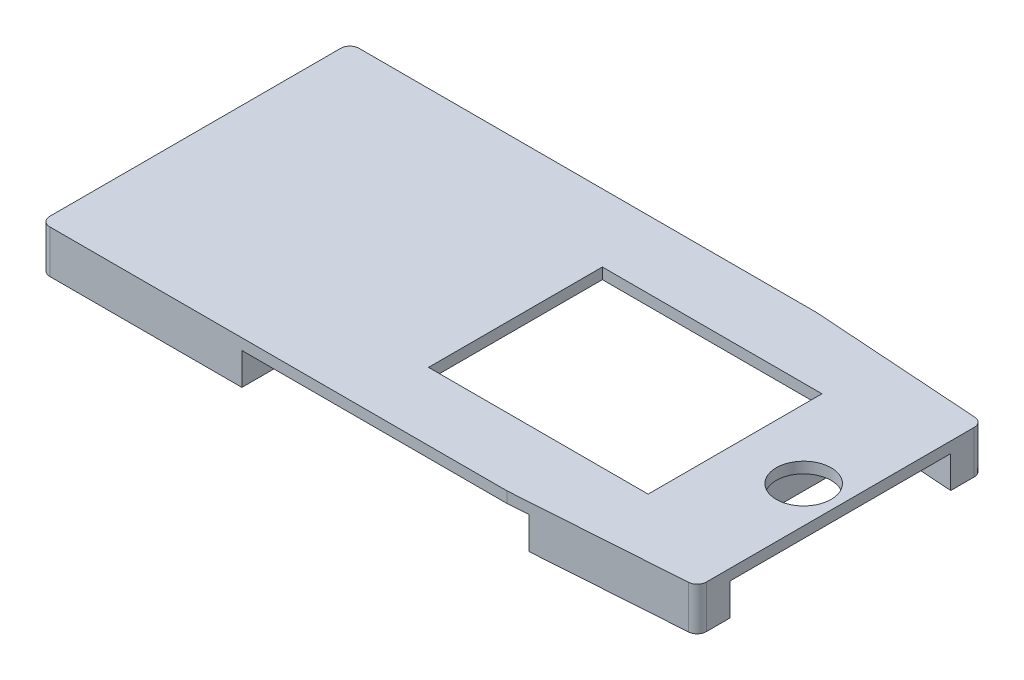
ISO-10303-21;
HEADER;
FILE_DESCRIPTION(('STEP AP214'),'2;1');
FILE_NAME('part.step','',(''),(''),'','','');
FILE_SCHEMA(('AUTOMOTIVE_DESIGN { 1 0 10303 214 1 1 1 1 }'));
ENDSEC;
DATA;
#1=APPLICATION_CONTEXT('core data for automotive mechanical design processes');
#2=APPLICATION_PROTOCOL_DEFINITION('international standard','automotive_design',2000,#1);
#3=PRODUCT_CONTEXT('',#1,'mechanical');
#4=PRODUCT('Part','Part','',(#3));
#5=PRODUCT_RELATED_PRODUCT_CATEGORY('part','',(#4));
#6=PRODUCT_DEFINITION_FORMATION('','',#4);
#7=PRODUCT_DEFINITION_CONTEXT('part definition',#1,'design');
#8=PRODUCT_DEFINITION('design','',#6,#7);
#9=PRODUCT_DEFINITION_SHAPE('','',#8);
#10=(LENGTH_UNIT() NAMED_UNIT(*) SI_UNIT(.MILLI.,.METRE.));
#11=(NAMED_UNIT(*) PLANE_ANGLE_UNIT() SI_UNIT($,.RADIAN.));
#12=(NAMED_UNIT(*) SI_UNIT($,.STERADIAN.) SOLID_ANGLE_UNIT());
#13=UNCERTAINTY_MEASURE_WITH_UNIT(LENGTH_MEASURE(1.E-05),#10,'distance_accuracy_value','');
#14=(GEOMETRIC_REPRESENTATION_CONTEXT(3) GLOBAL_UNCERTAINTY_ASSIGNED_CONTEXT((#13)) GLOBAL_UNIT_ASSIGNED_CONTEXT((#10,
#11,#12)) REPRESENTATION_CONTEXT('',''));
#15=CARTESIAN_POINT('',(0.,0.,0.));
#16=DIRECTION('',(0.,0.,1.));
#17=DIRECTION('',(1.,0.,0.));
#18=AXIS2_PLACEMENT_3D('',#15,#16,#17);
#19=CARTESIAN_POINT('',(0.,0.,0.));
#20=DIRECTION('',(0.,-1.,0.));
#21=DIRECTION('',(0.,0.,-1.));
#22=AXIS2_PLACEMENT_3D('',#19,#20,#21);
#23=PLANE('',#22);
#24=CARTESIAN_POINT('',(66.5,0.,-16.9));
#25=DIRECTION('',(0.,1.,0.));
#26=DIRECTION('',(0.,0.,1.));
#27=AXIS2_PLACEMENT_3D('',#24,#25,#26);
#28=CIRCLE('',#27,3.00000000000001);
#29=CARTESIAN_POINT('',(66.5,0.,-13.9));
#30=VERTEX_POINT('',#29);
#31=EDGE_CURVE('E436',#30,#30,#28,.T.);
#32=ORIENTED_EDGE('',*,*,#31,.T.);
#33=EDGE_LOOP('',(#32));
#34=FACE_BOUND('',#33,.T.);
#35=DIRECTION('',(0.0677923984636741,0.,-0.997699449088022));
#36=VECTOR('',#35,1.);
#37=CARTESIAN_POINT('',(53.2367275350985,0.,-33.6480172315895));
#38=LINE('',#37,#36);
#39=CARTESIAN_POINT('',(53.,0.,-30.1641025641026));
#40=VERTEX_POINT('',#39);
#41=CARTESIAN_POINT('',(53.2367275350985,0.,-33.6480172315895));
#42=VERTEX_POINT('',#41);
#43=EDGE_CURVE('E318',#40,#42,#38,.T.);
#44=ORIENTED_EDGE('',*,*,#43,.F.);
#45=DIRECTION('',(-0.997699449088022,0.,-0.0677923984636733));
#46=VECTOR('',#45,1.);
#47=CARTESIAN_POINT('',(53.,0.,-30.1641025641026));
#48=LINE('',#47,#46);
#49=CARTESIAN_POINT('',(70.5,0.,-28.975));
#50=VERTEX_POINT('',#49);
#51=EDGE_CURVE('E322',#50,#40,#48,.T.);
#52=ORIENTED_EDGE('',*,*,#51,.F.);
#53=DIRECTION('',(0.,0.,-1.));
#54=VECTOR('',#53,1.);
#55=CARTESIAN_POINT('',(70.5,0.,-32.475));
#56=LINE('',#55,#54);
#57=CARTESIAN_POINT('',(70.5,0.,-4.825));
#58=VERTEX_POINT('',#57);
#59=EDGE_CURVE('E499',#58,#50,#56,.T.);
#60=ORIENTED_EDGE('',*,*,#59,.F.);
#61=DIRECTION('',(0.997699449088022,0.,-0.067792398463673));
#62=VECTOR('',#61,1.);
#63=CARTESIAN_POINT('',(53.,0.,-3.63589743589744));
#64=LINE('',#63,#62);
#65=CARTESIAN_POINT('',(53.,0.,-3.63589743589744));
#66=VERTEX_POINT('',#65);
#67=EDGE_CURVE('E348',#66,#58,#64,.T.);
#68=ORIENTED_EDGE('',*,*,#67,.F.);
#69=DIRECTION('',(-0.067792398463674,0.,-0.997699449088022));
#70=VECTOR('',#69,1.);
#71=CARTESIAN_POINT('',(53.2367275350985,0.,-0.151982768410537));
#72=LINE('',#71,#70);
#73=CARTESIAN_POINT('',(53.2367275350985,0.,-0.151982768410537));
#74=VERTEX_POINT('',#73);
#75=EDGE_CURVE('E352',#74,#66,#72,.T.);
#76=ORIENTED_EDGE('',*,*,#75,.F.);
#77=DIRECTION('',(0.997699449088022,0.,-0.0677923984636733));
#78=VECTOR('',#77,1.);
#79=CARTESIAN_POINT('',(70.5,0.,-1.325));
#80=LINE('',#79,#78);
#81=CARTESIAN_POINT('',(51.,0.,0.));
#82=VERTEX_POINT('',#81);
#83=EDGE_CURVE('E495',#82,#74,#80,.T.);
#84=ORIENTED_EDGE('',*,*,#83,.F.);
#85=DIRECTION('',(1.,0.,0.));
#86=VECTOR('',#85,1.);
#87=CARTESIAN_POINT('',(0.,0.,0.));
#88=LINE('',#87,#86);
#89=CARTESIAN_POINT('',(22.,0.,0.));
#90=VERTEX_POINT('',#89);
#91=EDGE_CURVE('E468',#90,#82,#88,.T.);
#92=ORIENTED_EDGE('',*,*,#91,.F.);
#93=DIRECTION('',(0.,0.,1.));
#94=VECTOR('',#93,1.);
#95=CARTESIAN_POINT('',(22.,0.,0.));
#96=LINE('',#95,#94);
#97=CARTESIAN_POINT('',(22.,0.,-3.5));
#98=VERTEX_POINT('',#97);
#99=EDGE_CURVE('E372',#98,#90,#96,.T.);
#100=ORIENTED_EDGE('',*,*,#99,.F.);
#101=DIRECTION('',(1.,0.,0.));
#102=VECTOR('',#101,1.);
#103=CARTESIAN_POINT('',(3.5,0.,-3.5));
#104=LINE('',#103,#102);
#105=CARTESIAN_POINT('',(3.5,0.,-3.5));
#106=VERTEX_POINT('',#105);
#107=EDGE_CURVE('E406',#106,#98,#104,.T.);
#108=ORIENTED_EDGE('',*,*,#107,.F.);
#109=DIRECTION('',(0.,0.,1.));
#110=VECTOR('',#109,1.);
#111=CARTESIAN_POINT('',(3.5,0.,-30.3));
#112=LINE('',#111,#110);
#113=CARTESIAN_POINT('',(3.5,0.,-30.3));
#114=VERTEX_POINT('',#113);
#115=EDGE_CURVE('E402',#114,#106,#112,.T.);
#116=ORIENTED_EDGE('',*,*,#115,.F.);
#117=DIRECTION('',(-1.,0.,0.));
#118=VECTOR('',#117,1.);
#119=CARTESIAN_POINT('',(3.5,0.,-30.3));
#120=LINE('',#119,#118);
#121=CARTESIAN_POINT('',(22.,0.,-30.3));
#122=VERTEX_POINT('',#121);
#123=EDGE_CURVE('E398',#122,#114,#120,.T.);
#124=ORIENTED_EDGE('',*,*,#123,.F.);
#125=DIRECTION('',(0.,0.,1.));
#126=VECTOR('',#125,1.);
#127=CARTESIAN_POINT('',(22.,0.,-33.8));
#128=LINE('',#127,#126);
#129=CARTESIAN_POINT('',(22.,0.,-33.8));
#130=VERTEX_POINT('',#129);
#131=EDGE_CURVE('E356',#130,#122,#128,.T.);
#132=ORIENTED_EDGE('',*,*,#131,.F.);
#133=DIRECTION('',(-1.,0.,0.));
#134=VECTOR('',#133,1.);
#135=CARTESIAN_POINT('',(0.,0.,-33.8));
#136=LINE('',#135,#134);
#137=CARTESIAN_POINT('',(51.,0.,-33.8));
#138=VERTEX_POINT('',#137);
#139=EDGE_CURVE('E474',#138,#130,#136,.T.);
#140=ORIENTED_EDGE('',*,*,#139,.F.);
#141=DIRECTION('',(-0.997699449088022,0.,-0.0677923984636733));
#142=VECTOR('',#141,1.);
#143=CARTESIAN_POINT('',(51.,0.,-33.8));
#144=LINE('',#143,#142);
#145=EDGE_CURVE('E503',#42,#138,#144,.T.);
#146=ORIENTED_EDGE('',*,*,#145,.F.);
#147=EDGE_LOOP('',(#44,#52,#60,#68,#76,#84,#92,#100,#108,#116,#124,#132,#140,#146));
#148=FACE_BOUND('',#147,.T.);
#149=DIRECTION('',(0.,0.,1.));
#150=VECTOR('',#149,1.);
#151=CARTESIAN_POINT('',(62.5,0.,-7.4));
#152=LINE('',#151,#150);
#153=CARTESIAN_POINT('',(62.5,0.,-26.4));
#154=VERTEX_POINT('',#153);
#155=CARTESIAN_POINT('',(62.5,0.,-7.4));
#156=VERTEX_POINT('',#155);
#157=EDGE_CURVE('E267',#154,#156,#152,.T.);
#158=ORIENTED_EDGE('',*,*,#157,.F.);
#159=DIRECTION('',(1.,0.,0.));
#160=VECTOR('',#159,1.);
#161=CARTESIAN_POINT('',(59.,0.,-26.4));
#162=LINE('',#161,#160);
#163=CARTESIAN_POINT('',(59.,0.,-26.4));
#164=VERTEX_POINT('',#163);
#165=EDGE_CURVE('E265',#164,#154,#162,.T.);
#166=ORIENTED_EDGE('',*,*,#165,.F.);
#167=DIRECTION('',(-1.,0.,0.));
#168=VECTOR('',#167,1.);
#169=CARTESIAN_POINT('',(35.,0.,-26.4));
#170=LINE('',#169,#168);
#171=CARTESIAN_POINT('',(35.,0.,-26.4));
#172=VERTEX_POINT('',#171);
#173=EDGE_CURVE('E237',#164,#172,#170,.T.);
#174=ORIENTED_EDGE('',*,*,#173,.T.);
#175=DIRECTION('',(0.,0.,1.));
#176=VECTOR('',#175,1.);
#177=CARTESIAN_POINT('',(35.,0.,-26.4));
#178=LINE('',#177,#176);
#179=CARTESIAN_POINT('',(35.,0.,-7.4));
#180=VERTEX_POINT('',#179);
#181=EDGE_CURVE('E441',#172,#180,#178,.T.);
#182=ORIENTED_EDGE('',*,*,#181,.T.);
#183=DIRECTION('',(1.,0.,0.));
#184=VECTOR('',#183,1.);
#185=CARTESIAN_POINT('',(35.,0.,-7.4));
#186=LINE('',#185,#184);
#187=CARTESIAN_POINT('',(59.,0.,-7.4));
#188=VERTEX_POINT('',#187);
#189=EDGE_CURVE('E249',#180,#188,#186,.T.);
#190=ORIENTED_EDGE('',*,*,#189,.T.);
#191=DIRECTION('',(-1.,0.,0.));
#192=VECTOR('',#191,1.);
#193=CARTESIAN_POINT('',(59.,0.,-7.4));
#194=LINE('',#193,#192);
#195=EDGE_CURVE('E292',#156,#188,#194,.T.);
#196=ORIENTED_EDGE('',*,*,#195,.F.);
#197=EDGE_LOOP('',(#158,#166,#174,#182,#190,#196));
#198=FACE_BOUND('',#197,.T.);
#199=ADVANCED_FACE('F45',(#34,#148,#198),#23,.T.);
#200=CARTESIAN_POINT('',(0.,1.2,0.));
#201=DIRECTION('',(0.,-1.,0.));
#202=DIRECTION('',(0.,0.,-1.));
#203=AXIS2_PLACEMENT_3D('',#200,#201,#202);
#204=PLANE('',#203);
#205=DIRECTION('',(-1.,0.,0.));
#206=VECTOR('',#205,1.);
#207=CARTESIAN_POINT('',(0.,1.2,-33.8));
#208=LINE('',#207,#206);
#209=CARTESIAN_POINT('',(51.,1.2,-33.8));
#210=VERTEX_POINT('',#209);
#211=CARTESIAN_POINT('',(1.,1.2,-33.8));
#212=VERTEX_POINT('',#211);
#213=EDGE_CURVE('E488',#210,#212,#208,.T.);
#214=ORIENTED_EDGE('',*,*,#213,.T.);
#215=CARTESIAN_POINT('',(1.,1.2,-32.8));
#216=DIRECTION('',(0.,-1.,0.));
#217=DIRECTION('',(0.,0.,-1.));
#218=AXIS2_PLACEMENT_3D('',#215,#216,#217);
#219=CIRCLE('',#218,1.);
#220=CARTESIAN_POINT('',(0.,1.2,-32.8));
#221=VERTEX_POINT('',#220);
#222=EDGE_CURVE('E541',#212,#221,#219,.F.);
#223=ORIENTED_EDGE('',*,*,#222,.T.);
#224=DIRECTION('',(0.,0.,1.));
#225=VECTOR('',#224,1.);
#226=CARTESIAN_POINT('',(0.,1.2,0.));
#227=LINE('',#226,#225);
#228=CARTESIAN_POINT('',(0.,1.2,-1.));
#229=VERTEX_POINT('',#228);
#230=EDGE_CURVE('E469',#221,#229,#227,.T.);
#231=ORIENTED_EDGE('',*,*,#230,.T.);
#232=CARTESIAN_POINT('',(1.,1.2,-1.));
#233=DIRECTION('',(0.,-1.,0.));
#234=DIRECTION('',(0.,0.,-1.));
#235=AXIS2_PLACEMENT_3D('',#232,#233,#234);
#236=CIRCLE('',#235,1.);
#237=CARTESIAN_POINT('',(1.,1.2,0.));
#238=VERTEX_POINT('',#237);
#239=EDGE_CURVE('E532',#229,#238,#236,.F.);
#240=ORIENTED_EDGE('',*,*,#239,.T.);
#241=DIRECTION('',(1.,0.,0.));
#242=VECTOR('',#241,1.);
#243=CARTESIAN_POINT('',(0.,1.2,0.));
#244=LINE('',#243,#242);
#245=CARTESIAN_POINT('',(51.,1.2,0.));
#246=VERTEX_POINT('',#245);
#247=EDGE_CURVE('E473',#238,#246,#244,.T.);
#248=ORIENTED_EDGE('',*,*,#247,.T.);
#249=DIRECTION('',(0.997699449088022,0.,-0.0677923984636733));
#250=VECTOR('',#249,1.);
#251=CARTESIAN_POINT('',(70.5,1.2,-1.325));
#252=LINE('',#251,#250);
#253=CARTESIAN_POINT('',(69.5677923984637,1.2,-1.26165768861356));
#254=VERTEX_POINT('',#253);
#255=EDGE_CURVE('E477',#246,#254,#252,.T.);
#256=ORIENTED_EDGE('',*,*,#255,.T.);
#257=CARTESIAN_POINT('',(69.5,1.2,-2.25935713770158));
#258=DIRECTION('',(0.,-1.,0.));
#259=DIRECTION('',(0.,0.,-1.));
#260=AXIS2_PLACEMENT_3D('',#257,#258,#259);
#261=CIRCLE('',#260,1.);
#262=CARTESIAN_POINT('',(70.5,1.2,-2.25935713770158));
#263=VERTEX_POINT('',#262);
#264=EDGE_CURVE('E535',#254,#263,#261,.F.);
#265=ORIENTED_EDGE('',*,*,#264,.T.);
#266=DIRECTION('',(0.,0.,-1.));
#267=VECTOR('',#266,1.);
#268=CARTESIAN_POINT('',(70.5,1.2,-32.475));
#269=LINE('',#268,#267);
#270=CARTESIAN_POINT('',(70.5,1.2,-31.5406428622984));
#271=VERTEX_POINT('',#270);
#272=EDGE_CURVE('E481',#263,#271,#269,.T.);
#273=ORIENTED_EDGE('',*,*,#272,.T.);
#274=CARTESIAN_POINT('',(69.5,1.2,-31.5406428622984));
#275=DIRECTION('',(0.,-1.,0.));
#276=DIRECTION('',(0.,0.,-1.));
#277=AXIS2_PLACEMENT_3D('',#274,#275,#276);
#278=CIRCLE('',#277,1.);
#279=CARTESIAN_POINT('',(69.5677923984637,1.2,-32.5383423113864));
#280=VERTEX_POINT('',#279);
#281=EDGE_CURVE('E538',#271,#280,#278,.F.);
#282=ORIENTED_EDGE('',*,*,#281,.T.);
#283=DIRECTION('',(-0.997699449088022,0.,-0.0677923984636733));
#284=VECTOR('',#283,1.);
#285=CARTESIAN_POINT('',(51.,1.2,-33.8));
#286=LINE('',#285,#284);
#287=EDGE_CURVE('E485',#280,#210,#286,.T.);
#288=ORIENTED_EDGE('',*,*,#287,.T.);
#289=EDGE_LOOP('',(#214,#223,#231,#240,#248,#256,#265,#273,#282,#288));
#290=FACE_BOUND('',#289,.T.);
#291=DIRECTION('',(0.,0.,1.));
#292=VECTOR('',#291,1.);
#293=CARTESIAN_POINT('',(35.,1.2,-26.4));
#294=LINE('',#293,#292);
#295=CARTESIAN_POINT('',(35.,1.2,-26.4));
#296=VERTEX_POINT('',#295);
#297=CARTESIAN_POINT('',(35.,1.2,-7.4));
#298=VERTEX_POINT('',#297);
#299=EDGE_CURVE('E248',#296,#298,#294,.T.);
#300=ORIENTED_EDGE('',*,*,#299,.F.);
#301=DIRECTION('',(-1.,0.,0.));
#302=VECTOR('',#301,1.);
#303=CARTESIAN_POINT('',(35.,1.2,-26.4));
#304=LINE('',#303,#302);
#305=CARTESIAN_POINT('',(59.,1.2,-26.4));
#306=VERTEX_POINT('',#305);
#307=EDGE_CURVE('E452',#306,#296,#304,.T.);
#308=ORIENTED_EDGE('',*,*,#307,.F.);
#309=DIRECTION('',(0.,0.,-1.));
#310=VECTOR('',#309,1.);
#311=CARTESIAN_POINT('',(59.,1.2,-26.4));
#312=LINE('',#311,#310);
#313=CARTESIAN_POINT('',(59.,1.2,-7.4));
#314=VERTEX_POINT('',#313);
#315=EDGE_CURVE('E259',#314,#306,#312,.T.);
#316=ORIENTED_EDGE('',*,*,#315,.F.);
#317=DIRECTION('',(1.,0.,0.));
#318=VECTOR('',#317,1.);
#319=CARTESIAN_POINT('',(35.,1.2,-7.4));
#320=LINE('',#319,#318);
#321=EDGE_CURVE('E447',#298,#314,#320,.T.);
#322=ORIENTED_EDGE('',*,*,#321,.F.);
#323=EDGE_LOOP('',(#300,#308,#316,#322));
#324=FACE_BOUND('',#323,.T.);
#325=CARTESIAN_POINT('',(66.5,1.2,-16.9));
#326=DIRECTION('',(0.,1.,0.));
#327=DIRECTION('',(0.,0.,1.));
#328=AXIS2_PLACEMENT_3D('',#325,#326,#327);
#329=CIRCLE('',#328,3.00000000000001);
#330=CARTESIAN_POINT('',(66.5,1.2,-13.9));
#331=VERTEX_POINT('',#330);
#332=EDGE_CURVE('E437',#331,#331,#329,.T.);
#333=ORIENTED_EDGE('',*,*,#332,.F.);
#334=EDGE_LOOP('',(#333));
#335=FACE_BOUND('',#334,.T.);
#336=ADVANCED_FACE('F565',(#290,#324,#335),#204,.F.);
#337=CARTESIAN_POINT('',(0.,1.2,0.));
#338=DIRECTION('',(1.,0.,0.));
#339=DIRECTION('',(0.,0.,-1.));
#340=AXIS2_PLACEMENT_3D('',#337,#338,#339);
#341=PLANE('',#340);
#342=ORIENTED_EDGE('',*,*,#230,.F.);
#343=DIRECTION('',(0.,-1.,0.));
#344=VECTOR('',#343,1.);
#345=CARTESIAN_POINT('',(0.,1.2,-32.8));
#346=LINE('',#345,#344);
#347=CARTESIAN_POINT('',(0.,-3.5,-32.8));
#348=VERTEX_POINT('',#347);
#349=EDGE_CURVE('E519',#221,#348,#346,.T.);
#350=ORIENTED_EDGE('',*,*,#349,.T.);
#351=DIRECTION('',(0.,0.,-1.));
#352=VECTOR('',#351,1.);
#353=CARTESIAN_POINT('',(0.,-3.5,0.));
#354=LINE('',#353,#352);
#355=CARTESIAN_POINT('',(0.,-3.5,-1.));
#356=VERTEX_POINT('',#355);
#357=EDGE_CURVE('E367',#356,#348,#354,.T.);
#358=ORIENTED_EDGE('',*,*,#357,.F.);
#359=DIRECTION('',(0.,-1.,0.));
#360=VECTOR('',#359,1.);
#361=CARTESIAN_POINT('',(0.,1.2,-1.));
#362=LINE('',#361,#360);
#363=EDGE_CURVE('E516',#356,#229,#362,.F.);
#364=ORIENTED_EDGE('',*,*,#363,.T.);
#365=EDGE_LOOP('',(#342,#350,#358,#364));
#366=FACE_BOUND('',#365,.T.);
#367=ADVANCED_FACE('F623',(#366),#341,.F.);
#368=CARTESIAN_POINT('',(0.,1.2,0.));
#369=DIRECTION('',(0.,0.,-1.));
#370=DIRECTION('',(-1.,0.,0.));
#371=AXIS2_PLACEMENT_3D('',#368,#369,#370);
#372=PLANE('',#371);
#373=ORIENTED_EDGE('',*,*,#247,.F.);
#374=DIRECTION('',(0.,-1.,0.));
#375=VECTOR('',#374,1.);
#376=CARTESIAN_POINT('',(1.,1.2,0.));
#377=LINE('',#376,#375);
#378=CARTESIAN_POINT('',(1.,-3.5,0.));
#379=VERTEX_POINT('',#378);
#380=EDGE_CURVE('E11',#238,#379,#377,.T.);
#381=ORIENTED_EDGE('',*,*,#380,.T.);
#382=DIRECTION('',(-1.,0.,0.));
#383=VECTOR('',#382,1.);
#384=CARTESIAN_POINT('',(0.,-3.5,0.));
#385=LINE('',#384,#383);
#386=CARTESIAN_POINT('',(22.,-3.5,0.));
#387=VERTEX_POINT('',#386);
#388=EDGE_CURVE('E390',#387,#379,#385,.T.);
#389=ORIENTED_EDGE('',*,*,#388,.F.);
#390=DIRECTION('',(0.,1.,0.));
#391=VECTOR('',#390,1.);
#392=CARTESIAN_POINT('',(22.,-3.5,0.));
#393=LINE('',#392,#391);
#394=EDGE_CURVE('E394',#387,#90,#393,.T.);
#395=ORIENTED_EDGE('',*,*,#394,.T.);
#396=ORIENTED_EDGE('',*,*,#91,.T.);
#397=DIRECTION('',(0.,-1.,0.));
#398=VECTOR('',#397,1.);
#399=CARTESIAN_POINT('',(51.,1.2,0.));
#400=LINE('',#399,#398);
#401=EDGE_CURVE('E512',#246,#82,#400,.T.);
#402=ORIENTED_EDGE('',*,*,#401,.F.);
#403=EDGE_LOOP('',(#373,#381,#389,#395,#396,#402));
#404=FACE_BOUND('',#403,.T.);
#405=ADVANCED_FACE('F632',(#404),#372,.F.);
#406=CARTESIAN_POINT('',(70.5,1.2,-1.325));
#407=DIRECTION('',(-0.0677923984636733,0.,-0.997699449088022));
#408=DIRECTION('',(-0.997699449088022,0.,0.0677923984636733));
#409=AXIS2_PLACEMENT_3D('',#406,#407,#408);
#410=PLANE('',#409);
#411=DIRECTION('',(-0.997699449088022,0.,0.0677923984636733));
#412=VECTOR('',#411,1.);
#413=CARTESIAN_POINT('',(53.2367275350985,-3.5,-0.151982768410537));
#414=LINE('',#413,#412);
#415=CARTESIAN_POINT('',(69.5677923984637,-3.5,-1.26165768861356));
#416=VERTEX_POINT('',#415);
#417=CARTESIAN_POINT('',(53.2367275350985,-3.5,-0.151982768410537));
#418=VERTEX_POINT('',#417);
#419=EDGE_CURVE('E362',#416,#418,#414,.T.);
#420=ORIENTED_EDGE('',*,*,#419,.F.);
#421=DIRECTION('',(0.,-1.,0.));
#422=VECTOR('',#421,1.);
#423=CARTESIAN_POINT('',(69.5677923984637,1.2,-1.26165768861356));
#424=LINE('',#423,#422);
#425=EDGE_CURVE('E54',#416,#254,#424,.F.);
#426=ORIENTED_EDGE('',*,*,#425,.T.);
#427=ORIENTED_EDGE('',*,*,#255,.F.);
#428=ORIENTED_EDGE('',*,*,#401,.T.);
#429=ORIENTED_EDGE('',*,*,#83,.T.);
#430=DIRECTION('',(0.,1.,0.));
#431=VECTOR('',#430,1.);
#432=CARTESIAN_POINT('',(53.2367275350985,-3.5,-0.151982768410537));
#433=LINE('',#432,#431);
#434=EDGE_CURVE('E326',#418,#74,#433,.T.);
#435=ORIENTED_EDGE('',*,*,#434,.F.);
#436=EDGE_LOOP('',(#420,#426,#427,#428,#429,#435));
#437=FACE_BOUND('',#436,.T.);
#438=ADVANCED_FACE('F561',(#437),#410,.F.);
#439=CARTESIAN_POINT('',(70.5,1.2,-32.475));
#440=DIRECTION('',(-1.,0.,0.));
#441=DIRECTION('',(0.,0.,1.));
#442=AXIS2_PLACEMENT_3D('',#439,#440,#441);
#443=PLANE('',#442);
#444=DIRECTION('',(0.,0.,1.));
#445=VECTOR('',#444,1.);
#446=CARTESIAN_POINT('',(70.5,-3.5,-28.975));
#447=LINE('',#446,#445);
#448=CARTESIAN_POINT('',(70.5,-3.5,-31.5406428622984));
#449=VERTEX_POINT('',#448);
#450=CARTESIAN_POINT('',(70.5,-3.5,-28.975));
#451=VERTEX_POINT('',#450);
#452=EDGE_CURVE('E323',#449,#451,#447,.T.);
#453=ORIENTED_EDGE('',*,*,#452,.F.);
#454=DIRECTION('',(0.,-1.,0.));
#455=VECTOR('',#454,1.);
#456=CARTESIAN_POINT('',(70.5,1.2,-31.5406428622984));
#457=LINE('',#456,#455);
#458=EDGE_CURVE('E554',#449,#271,#457,.F.);
#459=ORIENTED_EDGE('',*,*,#458,.T.);
#460=ORIENTED_EDGE('',*,*,#272,.F.);
#461=DIRECTION('',(0.,-1.,0.));
#462=VECTOR('',#461,1.);
#463=CARTESIAN_POINT('',(70.5,1.2,-2.25935713770158));
#464=LINE('',#463,#462);
#465=CARTESIAN_POINT('',(70.5,-3.5,-2.25935713770158));
#466=VERTEX_POINT('',#465);
#467=EDGE_CURVE('E551',#263,#466,#464,.T.);
#468=ORIENTED_EDGE('',*,*,#467,.T.);
#469=DIRECTION('',(0.,0.,1.));
#470=VECTOR('',#469,1.);
#471=CARTESIAN_POINT('',(70.5,-3.5,-4.825));
#472=LINE('',#471,#470);
#473=CARTESIAN_POINT('',(70.5,-3.5,-4.825));
#474=VERTEX_POINT('',#473);
#475=EDGE_CURVE('E353',#474,#466,#472,.T.);
#476=ORIENTED_EDGE('',*,*,#475,.F.);
#477=DIRECTION('',(0.,1.,0.));
#478=VECTOR('',#477,1.);
#479=CARTESIAN_POINT('',(70.5,-3.5,-4.825));
#480=LINE('',#479,#478);
#481=EDGE_CURVE('E344',#474,#58,#480,.T.);
#482=ORIENTED_EDGE('',*,*,#481,.T.);
#483=ORIENTED_EDGE('',*,*,#59,.T.);
#484=DIRECTION('',(0.,1.,0.));
#485=VECTOR('',#484,1.);
#486=CARTESIAN_POINT('',(70.5,-3.5,-28.975));
#487=LINE('',#486,#485);
#488=EDGE_CURVE('E272',#451,#50,#487,.T.);
#489=ORIENTED_EDGE('',*,*,#488,.F.);
#490=EDGE_LOOP('',(#453,#459,#460,#468,#476,#482,#483,#489));
#491=FACE_BOUND('',#490,.T.);
#492=ADVANCED_FACE('F574',(#491),#443,.F.);
#493=CARTESIAN_POINT('',(51.,1.2,-33.8));
#494=DIRECTION('',(-0.0677923984636733,0.,0.997699449088022));
#495=DIRECTION('',(0.997699449088022,0.,0.0677923984636733));
#496=AXIS2_PLACEMENT_3D('',#493,#494,#495);
#497=PLANE('',#496);
#498=ORIENTED_EDGE('',*,*,#287,.F.);
#499=DIRECTION('',(0.,-1.,0.));
#500=VECTOR('',#499,1.);
#501=CARTESIAN_POINT('',(69.5677923984637,1.2,-32.5383423113864));
#502=LINE('',#501,#500);
#503=CARTESIAN_POINT('',(69.5677923984637,-3.5,-32.5383423113864));
#504=VERTEX_POINT('',#503);
#505=EDGE_CURVE('E544',#280,#504,#502,.T.);
#506=ORIENTED_EDGE('',*,*,#505,.T.);
#507=DIRECTION('',(0.997699449088022,0.,0.0677923984636732));
#508=VECTOR('',#507,1.);
#509=CARTESIAN_POINT('',(70.5,-3.5,-32.475));
#510=LINE('',#509,#508);
#511=CARTESIAN_POINT('',(53.2367275350985,-3.5,-33.6480172315895));
#512=VERTEX_POINT('',#511);
#513=EDGE_CURVE('E317',#512,#504,#510,.T.);
#514=ORIENTED_EDGE('',*,*,#513,.F.);
#515=DIRECTION('',(0.,1.,0.));
#516=VECTOR('',#515,1.);
#517=CARTESIAN_POINT('',(53.2367275350985,-3.5,-33.6480172315895));
#518=LINE('',#517,#516);
#519=EDGE_CURVE('E314',#512,#42,#518,.T.);
#520=ORIENTED_EDGE('',*,*,#519,.T.);
#521=ORIENTED_EDGE('',*,*,#145,.T.);
#522=DIRECTION('',(0.,-1.,0.));
#523=VECTOR('',#522,1.);
#524=CARTESIAN_POINT('',(51.,1.2,-33.8));
#525=LINE('',#524,#523);
#526=EDGE_CURVE('E492',#210,#138,#525,.T.);
#527=ORIENTED_EDGE('',*,*,#526,.F.);
#528=EDGE_LOOP('',(#498,#506,#514,#520,#521,#527));
#529=FACE_BOUND('',#528,.T.);
#530=ADVANCED_FACE('F609',(#529),#497,.F.);
#531=CARTESIAN_POINT('',(0.,1.2,-33.8));
#532=DIRECTION('',(0.,0.,1.));
#533=DIRECTION('',(1.,0.,0.));
#534=AXIS2_PLACEMENT_3D('',#531,#532,#533);
#535=PLANE('',#534);
#536=DIRECTION('',(1.,0.,0.));
#537=VECTOR('',#536,1.);
#538=CARTESIAN_POINT('',(0.,-3.5,-33.8));
#539=LINE('',#538,#537);
#540=CARTESIAN_POINT('',(1.,-3.5,-33.8));
#541=VERTEX_POINT('',#540);
#542=CARTESIAN_POINT('',(22.,-3.5,-33.8));
#543=VERTEX_POINT('',#542);
#544=EDGE_CURVE('E371',#541,#543,#539,.T.);
#545=ORIENTED_EDGE('',*,*,#544,.F.);
#546=DIRECTION('',(0.,-1.,0.));
#547=VECTOR('',#546,1.);
#548=CARTESIAN_POINT('',(1.,1.2,-33.8));
#549=LINE('',#548,#547);
#550=EDGE_CURVE('E529',#541,#212,#549,.F.);
#551=ORIENTED_EDGE('',*,*,#550,.T.);
#552=ORIENTED_EDGE('',*,*,#213,.F.);
#553=ORIENTED_EDGE('',*,*,#526,.T.);
#554=ORIENTED_EDGE('',*,*,#139,.T.);
#555=DIRECTION('',(0.,1.,0.));
#556=VECTOR('',#555,1.);
#557=CARTESIAN_POINT('',(22.,-3.5,-33.8));
#558=LINE('',#557,#556);
#559=EDGE_CURVE('E432',#543,#130,#558,.T.);
#560=ORIENTED_EDGE('',*,*,#559,.F.);
#561=EDGE_LOOP('',(#545,#551,#552,#553,#554,#560));
#562=FACE_BOUND('',#561,.T.);
#563=ADVANCED_FACE('F614',(#562),#535,.F.);
#564=CARTESIAN_POINT('',(35.,1.2,-26.4));
#565=DIRECTION('',(1.,0.,0.));
#566=DIRECTION('',(0.,0.,-1.));
#567=AXIS2_PLACEMENT_3D('',#564,#565,#566);
#568=PLANE('',#567);
#569=ORIENTED_EDGE('',*,*,#181,.F.);
#570=DIRECTION('',(0.,-1.,0.));
#571=VECTOR('',#570,1.);
#572=CARTESIAN_POINT('',(35.,1.2,-26.4));
#573=LINE('',#572,#571);
#574=EDGE_CURVE('E243',#296,#172,#573,.T.);
#575=ORIENTED_EDGE('',*,*,#574,.F.);
#576=ORIENTED_EDGE('',*,*,#299,.T.);
#577=DIRECTION('',(0.,-1.,0.));
#578=VECTOR('',#577,1.);
#579=CARTESIAN_POINT('',(35.,1.2,-7.4));
#580=LINE('',#579,#578);
#581=EDGE_CURVE('E464',#298,#180,#580,.T.);
#582=ORIENTED_EDGE('',*,*,#581,.T.);
#583=EDGE_LOOP('',(#569,#575,#576,#582));
#584=FACE_BOUND('',#583,.T.);
#585=ADVANCED_FACE('F657',(#584),#568,.T.);
#586=CARTESIAN_POINT('',(35.,1.2,-7.4));
#587=DIRECTION('',(0.,0.,-1.));
#588=DIRECTION('',(-1.,0.,0.));
#589=AXIS2_PLACEMENT_3D('',#586,#587,#588);
#590=PLANE('',#589);
#591=ORIENTED_EDGE('',*,*,#189,.F.);
#592=ORIENTED_EDGE('',*,*,#581,.F.);
#593=ORIENTED_EDGE('',*,*,#321,.T.);
#594=DIRECTION('',(0.,-1.,0.));
#595=VECTOR('',#594,1.);
#596=CARTESIAN_POINT('',(59.,1.2,-7.4));
#597=LINE('',#596,#595);
#598=EDGE_CURVE('E262',#314,#188,#597,.T.);
#599=ORIENTED_EDGE('',*,*,#598,.T.);
#600=EDGE_LOOP('',(#591,#592,#593,#599));
#601=FACE_BOUND('',#600,.T.);
#602=ADVANCED_FACE('F858',(#601),#590,.T.);
#603=CARTESIAN_POINT('',(59.,1.2,-26.4));
#604=DIRECTION('',(-1.,0.,0.));
#605=DIRECTION('',(0.,0.,1.));
#606=AXIS2_PLACEMENT_3D('',#603,#604,#605);
#607=PLANE('',#606);
#608=DIRECTION('',(0.,-1.,0.));
#609=VECTOR('',#608,1.);
#610=CARTESIAN_POINT('',(59.,1.2,-26.4));
#611=LINE('',#610,#609);
#612=EDGE_CURVE('E240',#306,#164,#611,.T.);
#613=ORIENTED_EDGE('',*,*,#612,.T.);
#614=DIRECTION('',(0.,1.,0.));
#615=VECTOR('',#614,1.);
#616=CARTESIAN_POINT('',(59.,-3.5,-26.4));
#617=LINE('',#616,#615);
#618=CARTESIAN_POINT('',(59.,-3.5,-26.4));
#619=VERTEX_POINT('',#618);
#620=EDGE_CURVE('E256',#619,#164,#617,.T.);
#621=ORIENTED_EDGE('',*,*,#620,.F.);
#622=DIRECTION('',(0.,0.,-1.));
#623=VECTOR('',#622,1.);
#624=CARTESIAN_POINT('',(59.,-3.5,-7.4));
#625=LINE('',#624,#623);
#626=CARTESIAN_POINT('',(59.,-3.5,-7.4));
#627=VERTEX_POINT('',#626);
#628=EDGE_CURVE('E296',#627,#619,#625,.T.);
#629=ORIENTED_EDGE('',*,*,#628,.F.);
#630=DIRECTION('',(0.,1.,0.));
#631=VECTOR('',#630,1.);
#632=CARTESIAN_POINT('',(59.,-3.5,-7.4));
#633=LINE('',#632,#631);
#634=EDGE_CURVE('E287',#627,#188,#633,.T.);
#635=ORIENTED_EDGE('',*,*,#634,.T.);
#636=ORIENTED_EDGE('',*,*,#598,.F.);
#637=ORIENTED_EDGE('',*,*,#315,.T.);
#638=EDGE_LOOP('',(#613,#621,#629,#635,#636,#637));
#639=FACE_BOUND('',#638,.T.);
#640=ADVANCED_FACE('F253',(#639),#607,.T.);
#641=CARTESIAN_POINT('',(35.,1.2,-26.4));
#642=DIRECTION('',(0.,0.,1.));
#643=DIRECTION('',(1.,0.,0.));
#644=AXIS2_PLACEMENT_3D('',#641,#642,#643);
#645=PLANE('',#644);
#646=ORIENTED_EDGE('',*,*,#173,.F.);
#647=ORIENTED_EDGE('',*,*,#612,.F.);
#648=ORIENTED_EDGE('',*,*,#307,.T.);
#649=ORIENTED_EDGE('',*,*,#574,.T.);
#650=EDGE_LOOP('',(#646,#647,#648,#649));
#651=FACE_BOUND('',#650,.T.);
#652=ADVANCED_FACE('F239',(#651),#645,.T.);
#653=CARTESIAN_POINT('',(66.5,1.2,-16.9));
#654=DIRECTION('',(0.,-1.,0.));
#655=DIRECTION('',(0.,0.,-1.));
#656=AXIS2_PLACEMENT_3D('',#653,#654,#655);
#657=CYLINDRICAL_SURFACE('',#656,3.00000000000001);
#658=ORIENTED_EDGE('',*,*,#332,.T.);
#659=EDGE_LOOP('',(#658));
#660=FACE_BOUND('',#659,.T.);
#661=ORIENTED_EDGE('',*,*,#31,.F.);
#662=EDGE_LOOP('',(#661));
#663=FACE_BOUND('',#662,.T.);
#664=ADVANCED_FACE('F829',(#660,#663),#657,.F.);
#665=CARTESIAN_POINT('',(22.,-3.5,-33.8));
#666=DIRECTION('',(-1.,0.,0.));
#667=DIRECTION('',(0.,0.,1.));
#668=AXIS2_PLACEMENT_3D('',#665,#666,#667);
#669=PLANE('',#668);
#670=ORIENTED_EDGE('',*,*,#131,.T.);
#671=DIRECTION('',(0.,1.,0.));
#672=VECTOR('',#671,1.);
#673=CARTESIAN_POINT('',(22.,-3.5,-30.3));
#674=LINE('',#673,#672);
#675=CARTESIAN_POINT('',(22.,-3.5,-30.3));
#676=VERTEX_POINT('',#675);
#677=EDGE_CURVE('E428',#676,#122,#674,.T.);
#678=ORIENTED_EDGE('',*,*,#677,.F.);
#679=DIRECTION('',(0.,0.,1.));
#680=VECTOR('',#679,1.);
#681=CARTESIAN_POINT('',(22.,-3.5,-33.8));
#682=LINE('',#681,#680);
#683=EDGE_CURVE('E375',#543,#676,#682,.T.);
#684=ORIENTED_EDGE('',*,*,#683,.F.);
#685=ORIENTED_EDGE('',*,*,#559,.T.);
#686=EDGE_LOOP('',(#670,#678,#684,#685));
#687=FACE_BOUND('',#686,.T.);
#688=ADVANCED_FACE('F819',(#687),#669,.F.);
#689=CARTESIAN_POINT('',(3.5,-3.5,-30.3));
#690=DIRECTION('',(0.,0.,-1.));
#691=DIRECTION('',(-1.,0.,0.));
#692=AXIS2_PLACEMENT_3D('',#689,#690,#691);
#693=PLANE('',#692);
#694=ORIENTED_EDGE('',*,*,#123,.T.);
#695=DIRECTION('',(0.,1.,0.));
#696=VECTOR('',#695,1.);
#697=CARTESIAN_POINT('',(3.5,-3.5,-30.3));
#698=LINE('',#697,#696);
#699=CARTESIAN_POINT('',(3.5,-3.5,-30.3));
#700=VERTEX_POINT('',#699);
#701=EDGE_CURVE('E424',#700,#114,#698,.T.);
#702=ORIENTED_EDGE('',*,*,#701,.F.);
#703=DIRECTION('',(-1.,0.,0.));
#704=VECTOR('',#703,1.);
#705=CARTESIAN_POINT('',(3.5,-3.5,-30.3));
#706=LINE('',#705,#704);
#707=EDGE_CURVE('E378',#676,#700,#706,.T.);
#708=ORIENTED_EDGE('',*,*,#707,.F.);
#709=ORIENTED_EDGE('',*,*,#677,.T.);
#710=EDGE_LOOP('',(#694,#702,#708,#709));
#711=FACE_BOUND('',#710,.T.);
#712=ADVANCED_FACE('F809',(#711),#693,.F.);
#713=CARTESIAN_POINT('',(3.5,-3.5,-30.3));
#714=DIRECTION('',(-1.,0.,0.));
#715=DIRECTION('',(0.,0.,1.));
#716=AXIS2_PLACEMENT_3D('',#713,#714,#715);
#717=PLANE('',#716);
#718=ORIENTED_EDGE('',*,*,#115,.T.);
#719=DIRECTION('',(0.,1.,0.));
#720=VECTOR('',#719,1.);
#721=CARTESIAN_POINT('',(3.5,-3.5,-3.5));
#722=LINE('',#721,#720);
#723=CARTESIAN_POINT('',(3.5,-3.5,-3.5));
#724=VERTEX_POINT('',#723);
#725=EDGE_CURVE('E420',#724,#106,#722,.T.);
#726=ORIENTED_EDGE('',*,*,#725,.F.);
#727=DIRECTION('',(0.,0.,1.));
#728=VECTOR('',#727,1.);
#729=CARTESIAN_POINT('',(3.5,-3.5,-30.3));
#730=LINE('',#729,#728);
#731=EDGE_CURVE('E381',#700,#724,#730,.T.);
#732=ORIENTED_EDGE('',*,*,#731,.F.);
#733=ORIENTED_EDGE('',*,*,#701,.T.);
#734=EDGE_LOOP('',(#718,#726,#732,#733));
#735=FACE_BOUND('',#734,.T.);
#736=ADVANCED_FACE('F799',(#735),#717,.F.);
#737=CARTESIAN_POINT('',(3.5,-3.5,-3.5));
#738=DIRECTION('',(0.,0.,1.));
#739=DIRECTION('',(1.,0.,0.));
#740=AXIS2_PLACEMENT_3D('',#737,#738,#739);
#741=PLANE('',#740);
#742=ORIENTED_EDGE('',*,*,#107,.T.);
#743=DIRECTION('',(0.,1.,0.));
#744=VECTOR('',#743,1.);
#745=CARTESIAN_POINT('',(22.,-3.5,-3.5));
#746=LINE('',#745,#744);
#747=CARTESIAN_POINT('',(22.,-3.5,-3.5));
#748=VERTEX_POINT('',#747);
#749=EDGE_CURVE('E416',#748,#98,#746,.T.);
#750=ORIENTED_EDGE('',*,*,#749,.F.);
#751=DIRECTION('',(1.,0.,0.));
#752=VECTOR('',#751,1.);
#753=CARTESIAN_POINT('',(3.5,-3.5,-3.5));
#754=LINE('',#753,#752);
#755=EDGE_CURVE('E384',#724,#748,#754,.T.);
#756=ORIENTED_EDGE('',*,*,#755,.F.);
#757=ORIENTED_EDGE('',*,*,#725,.T.);
#758=EDGE_LOOP('',(#742,#750,#756,#757));
#759=FACE_BOUND('',#758,.T.);
#760=ADVANCED_FACE('F789',(#759),#741,.F.);
#761=CARTESIAN_POINT('',(22.,-3.5,0.));
#762=DIRECTION('',(-1.,0.,0.));
#763=DIRECTION('',(0.,0.,1.));
#764=AXIS2_PLACEMENT_3D('',#761,#762,#763);
#765=PLANE('',#764);
#766=ORIENTED_EDGE('',*,*,#99,.T.);
#767=ORIENTED_EDGE('',*,*,#394,.F.);
#768=DIRECTION('',(0.,0.,1.));
#769=VECTOR('',#768,1.);
#770=CARTESIAN_POINT('',(22.,-3.5,0.));
#771=LINE('',#770,#769);
#772=EDGE_CURVE('E387',#748,#387,#771,.T.);
#773=ORIENTED_EDGE('',*,*,#772,.F.);
#774=ORIENTED_EDGE('',*,*,#749,.T.);
#775=EDGE_LOOP('',(#766,#767,#773,#774));
#776=FACE_BOUND('',#775,.T.);
#777=ADVANCED_FACE('F643',(#776),#765,.F.);
#778=CARTESIAN_POINT('',(0.,-3.5,0.));
#779=DIRECTION('',(0.,-1.,0.));
#780=DIRECTION('',(0.,0.,-1.));
#781=AXIS2_PLACEMENT_3D('',#778,#779,#780);
#782=PLANE('',#781);
#783=ORIENTED_EDGE('',*,*,#357,.T.);
#784=CARTESIAN_POINT('',(1.,-3.5,-32.8));
#785=DIRECTION('',(0.,-1.,0.));
#786=DIRECTION('',(0.,0.,-1.));
#787=AXIS2_PLACEMENT_3D('',#784,#785,#786);
#788=CIRCLE('',#787,1.);
#789=EDGE_CURVE('E526',#348,#541,#788,.T.);
#790=ORIENTED_EDGE('',*,*,#789,.T.);
#791=ORIENTED_EDGE('',*,*,#544,.T.);
#792=ORIENTED_EDGE('',*,*,#683,.T.);
#793=ORIENTED_EDGE('',*,*,#707,.T.);
#794=ORIENTED_EDGE('',*,*,#731,.T.);
#795=ORIENTED_EDGE('',*,*,#755,.T.);
#796=ORIENTED_EDGE('',*,*,#772,.T.);
#797=ORIENTED_EDGE('',*,*,#388,.T.);
#798=CARTESIAN_POINT('',(1.,-3.5,-1.));
#799=DIRECTION('',(0.,-1.,0.));
#800=DIRECTION('',(0.,0.,-1.));
#801=AXIS2_PLACEMENT_3D('',#798,#799,#800);
#802=CIRCLE('',#801,1.);
#803=EDGE_CURVE('E523',#379,#356,#802,.T.);
#804=ORIENTED_EDGE('',*,*,#803,.T.);
#805=EDGE_LOOP('',(#783,#790,#791,#792,#793,#794,#795,#796,#797,#804));
#806=FACE_BOUND('',#805,.T.);
#807=ADVANCED_FACE('F626',(#806),#782,.T.);
#808=CARTESIAN_POINT('',(53.2367275350985,-3.5,-0.151982768410537));
#809=DIRECTION('',(0.997699449088022,0.,-0.067792398463674));
#810=DIRECTION('',(-0.067792398463674,0.,-0.997699449088022));
#811=AXIS2_PLACEMENT_3D('',#808,#809,#810);
#812=PLANE('',#811);
#813=ORIENTED_EDGE('',*,*,#75,.T.);
#814=DIRECTION('',(0.,1.,0.));
#815=VECTOR('',#814,1.);
#816=CARTESIAN_POINT('',(53.,-3.5,-3.63589743589744));
#817=LINE('',#816,#815);
#818=CARTESIAN_POINT('',(53.,-3.5,-3.63589743589744));
#819=VERTEX_POINT('',#818);
#820=EDGE_CURVE('E340',#819,#66,#817,.T.);
#821=ORIENTED_EDGE('',*,*,#820,.F.);
#822=DIRECTION('',(-0.067792398463674,0.,-0.997699449088022));
#823=VECTOR('',#822,1.);
#824=CARTESIAN_POINT('',(53.2367275350985,-3.5,-0.151982768410537));
#825=LINE('',#824,#823);
#826=EDGE_CURVE('E359',#418,#819,#825,.T.);
#827=ORIENTED_EDGE('',*,*,#826,.F.);
#828=ORIENTED_EDGE('',*,*,#434,.T.);
#829=EDGE_LOOP('',(#813,#821,#827,#828));
#830=FACE_BOUND('',#829,.T.);
#831=ADVANCED_FACE('F635',(#830),#812,.F.);
#832=CARTESIAN_POINT('',(53.,-3.5,-3.63589743589744));
#833=DIRECTION('',(0.067792398463673,0.,0.997699449088022));
#834=DIRECTION('',(0.997699449088022,0.,-0.067792398463673));
#835=AXIS2_PLACEMENT_3D('',#832,#833,#834);
#836=PLANE('',#835);
#837=ORIENTED_EDGE('',*,*,#67,.T.);
#838=ORIENTED_EDGE('',*,*,#481,.F.);
#839=DIRECTION('',(0.997699449088022,0.,-0.067792398463673));
#840=VECTOR('',#839,1.);
#841=CARTESIAN_POINT('',(53.,-3.5,-3.63589743589744));
#842=LINE('',#841,#840);
#843=EDGE_CURVE('E347',#819,#474,#842,.T.);
#844=ORIENTED_EDGE('',*,*,#843,.F.);
#845=ORIENTED_EDGE('',*,*,#820,.T.);
#846=EDGE_LOOP('',(#837,#838,#844,#845));
#847=FACE_BOUND('',#846,.T.);
#848=ADVANCED_FACE('F581',(#847),#836,.F.);
#849=CARTESIAN_POINT('',(0.,-3.5,0.));
#850=DIRECTION('',(0.,1.,0.));
#851=DIRECTION('',(0.,0.,1.));
#852=AXIS2_PLACEMENT_3D('',#849,#850,#851);
#853=PLANE('',#852);
#854=ORIENTED_EDGE('',*,*,#475,.T.);
#855=CARTESIAN_POINT('',(69.5,-3.5,-2.25935713770158));
#856=DIRECTION('',(0.,1.,0.));
#857=DIRECTION('',(0.,0.,1.));
#858=AXIS2_PLACEMENT_3D('',#855,#856,#857);
#859=CIRCLE('',#858,1.);
#860=EDGE_CURVE('E61',#466,#416,#859,.F.);
#861=ORIENTED_EDGE('',*,*,#860,.T.);
#862=ORIENTED_EDGE('',*,*,#419,.T.);
#863=ORIENTED_EDGE('',*,*,#826,.T.);
#864=ORIENTED_EDGE('',*,*,#843,.T.);
#865=EDGE_LOOP('',(#854,#861,#862,#863,#864));
#866=FACE_BOUND('',#865,.T.);
#867=ADVANCED_FACE('F575',(#866),#853,.F.);
#868=CARTESIAN_POINT('',(53.,-3.5,-30.1641025641026));
#869=DIRECTION('',(0.0677923984636733,0.,-0.997699449088022));
#870=DIRECTION('',(-0.997699449088022,0.,-0.0677923984636733));
#871=AXIS2_PLACEMENT_3D('',#868,#869,#870);
#872=PLANE('',#871);
#873=ORIENTED_EDGE('',*,*,#51,.T.);
#874=DIRECTION('',(0.,1.,0.));
#875=VECTOR('',#874,1.);
#876=CARTESIAN_POINT('',(53.,-3.5,-30.1641025641026));
#877=LINE('',#876,#875);
#878=CARTESIAN_POINT('',(53.,-3.5,-30.1641025641026));
#879=VERTEX_POINT('',#878);
#880=EDGE_CURVE('E310',#879,#40,#877,.T.);
#881=ORIENTED_EDGE('',*,*,#880,.F.);
#882=DIRECTION('',(-0.997699449088022,0.,-0.0677923984636733));
#883=VECTOR('',#882,1.);
#884=CARTESIAN_POINT('',(53.,-3.5,-30.1641025641026));
#885=LINE('',#884,#883);
#886=EDGE_CURVE('E333',#451,#879,#885,.T.);
#887=ORIENTED_EDGE('',*,*,#886,.F.);
#888=ORIENTED_EDGE('',*,*,#488,.T.);
#889=EDGE_LOOP('',(#873,#881,#887,#888));
#890=FACE_BOUND('',#889,.T.);
#891=ADVANCED_FACE('F592',(#890),#872,.F.);
#892=CARTESIAN_POINT('',(53.2367275350985,-3.5,-33.6480172315895));
#893=DIRECTION('',(0.997699449088022,0.,0.0677923984636741));
#894=DIRECTION('',(0.0677923984636741,0.,-0.997699449088022));
#895=AXIS2_PLACEMENT_3D('',#892,#893,#894);
#896=PLANE('',#895);
#897=ORIENTED_EDGE('',*,*,#43,.T.);
#898=ORIENTED_EDGE('',*,*,#519,.F.);
#899=DIRECTION('',(0.0677923984636741,0.,-0.997699449088022));
#900=VECTOR('',#899,1.);
#901=CARTESIAN_POINT('',(53.2367275350985,-3.5,-33.6480172315895));
#902=LINE('',#901,#900);
#903=EDGE_CURVE('E330',#879,#512,#902,.T.);
#904=ORIENTED_EDGE('',*,*,#903,.F.);
#905=ORIENTED_EDGE('',*,*,#880,.T.);
#906=EDGE_LOOP('',(#897,#898,#904,#905));
#907=FACE_BOUND('',#906,.T.);
#908=ADVANCED_FACE('F596',(#907),#896,.F.);
#909=CARTESIAN_POINT('',(0.,-3.5,0.));
#910=DIRECTION('',(0.,1.,0.));
#911=DIRECTION('',(0.,0.,1.));
#912=AXIS2_PLACEMENT_3D('',#909,#910,#911);
#913=PLANE('',#912);
#914=ORIENTED_EDGE('',*,*,#513,.T.);
#915=CARTESIAN_POINT('',(69.5,-3.5,-31.5406428622984));
#916=DIRECTION('',(0.,1.,0.));
#917=DIRECTION('',(0.,0.,1.));
#918=AXIS2_PLACEMENT_3D('',#915,#916,#917);
#919=CIRCLE('',#918,1.);
#920=EDGE_CURVE('E548',#504,#449,#919,.F.);
#921=ORIENTED_EDGE('',*,*,#920,.T.);
#922=ORIENTED_EDGE('',*,*,#452,.T.);
#923=ORIENTED_EDGE('',*,*,#886,.T.);
#924=ORIENTED_EDGE('',*,*,#903,.T.);
#925=EDGE_LOOP('',(#914,#921,#922,#923,#924));
#926=FACE_BOUND('',#925,.T.);
#927=ADVANCED_FACE('F600',(#926),#913,.F.);
#928=CARTESIAN_POINT('',(59.,-3.5,-26.4));
#929=DIRECTION('',(0.,0.,1.));
#930=DIRECTION('',(1.,0.,0.));
#931=AXIS2_PLACEMENT_3D('',#928,#929,#930);
#932=PLANE('',#931);
#933=ORIENTED_EDGE('',*,*,#165,.T.);
#934=DIRECTION('',(0.,1.,0.));
#935=VECTOR('',#934,1.);
#936=CARTESIAN_POINT('',(62.5,-3.5,-26.4));
#937=LINE('',#936,#935);
#938=CARTESIAN_POINT('',(62.5,-3.5,-26.4));
#939=VERTEX_POINT('',#938);
#940=EDGE_CURVE('E278',#939,#154,#937,.T.);
#941=ORIENTED_EDGE('',*,*,#940,.F.);
#942=DIRECTION('',(1.,0.,0.));
#943=VECTOR('',#942,1.);
#944=CARTESIAN_POINT('',(59.,-3.5,-26.4));
#945=LINE('',#944,#943);
#946=EDGE_CURVE('E275',#619,#939,#945,.T.);
#947=ORIENTED_EDGE('',*,*,#946,.F.);
#948=ORIENTED_EDGE('',*,*,#620,.T.);
#949=EDGE_LOOP('',(#933,#941,#947,#948));
#950=FACE_BOUND('',#949,.T.);
#951=ADVANCED_FACE('F274',(#950),#932,.F.);
#952=CARTESIAN_POINT('',(62.5,-3.5,-7.4));
#953=DIRECTION('',(-1.,0.,0.));
#954=DIRECTION('',(0.,0.,1.));
#955=AXIS2_PLACEMENT_3D('',#952,#953,#954);
#956=PLANE('',#955);
#957=ORIENTED_EDGE('',*,*,#157,.T.);
#958=DIRECTION('',(0.,1.,0.));
#959=VECTOR('',#958,1.);
#960=CARTESIAN_POINT('',(62.5,-3.5,-7.4));
#961=LINE('',#960,#959);
#962=CARTESIAN_POINT('',(62.5,-3.5,-7.4));
#963=VERTEX_POINT('',#962);
#964=EDGE_CURVE('E281',#963,#156,#961,.T.);
#965=ORIENTED_EDGE('',*,*,#964,.F.);
#966=DIRECTION('',(0.,0.,1.));
#967=VECTOR('',#966,1.);
#968=CARTESIAN_POINT('',(62.5,-3.5,-7.4));
#969=LINE('',#968,#967);
#970=EDGE_CURVE('E301',#939,#963,#969,.T.);
#971=ORIENTED_EDGE('',*,*,#970,.F.);
#972=ORIENTED_EDGE('',*,*,#940,.T.);
#973=EDGE_LOOP('',(#957,#965,#971,#972));
#974=FACE_BOUND('',#973,.T.);
#975=ADVANCED_FACE('F715',(#974),#956,.F.);
#976=CARTESIAN_POINT('',(59.,-3.5,-7.4));
#977=DIRECTION('',(0.,0.,-1.));
#978=DIRECTION('',(-1.,0.,0.));
#979=AXIS2_PLACEMENT_3D('',#976,#977,#978);
#980=PLANE('',#979);
#981=ORIENTED_EDGE('',*,*,#195,.T.);
#982=ORIENTED_EDGE('',*,*,#634,.F.);
#983=DIRECTION('',(-1.,0.,0.));
#984=VECTOR('',#983,1.);
#985=CARTESIAN_POINT('',(59.,-3.5,-7.4));
#986=LINE('',#985,#984);
#987=EDGE_CURVE('E291',#963,#627,#986,.T.);
#988=ORIENTED_EDGE('',*,*,#987,.F.);
#989=ORIENTED_EDGE('',*,*,#964,.T.);
#990=EDGE_LOOP('',(#981,#982,#988,#989));
#991=FACE_BOUND('',#990,.T.);
#992=ADVANCED_FACE('F704',(#991),#980,.F.);
#993=CARTESIAN_POINT('',(0.,-3.5,0.));
#994=DIRECTION('',(0.,-1.,0.));
#995=DIRECTION('',(0.,0.,-1.));
#996=AXIS2_PLACEMENT_3D('',#993,#994,#995);
#997=PLANE('',#996);
#998=ORIENTED_EDGE('',*,*,#628,.T.);
#999=ORIENTED_EDGE('',*,*,#946,.T.);
#1000=ORIENTED_EDGE('',*,*,#970,.T.);
#1001=ORIENTED_EDGE('',*,*,#987,.T.);
#1002=EDGE_LOOP('',(#998,#999,#1000,#1001));
#1003=FACE_BOUND('',#1002,.T.);
#1004=ADVANCED_FACE('F670',(#1003),#997,.T.);
#1005=CARTESIAN_POINT('',(1.,1.2,-32.8));
#1006=DIRECTION('',(0.,-1.,0.));
#1007=DIRECTION('',(0.,0.,-1.));
#1008=AXIS2_PLACEMENT_3D('',#1005,#1006,#1007);
#1009=CYLINDRICAL_SURFACE('',#1008,1.);
#1010=ORIENTED_EDGE('',*,*,#222,.F.);
#1011=ORIENTED_EDGE('',*,*,#550,.F.);
#1012=ORIENTED_EDGE('',*,*,#789,.F.);
#1013=ORIENTED_EDGE('',*,*,#349,.F.);
#1014=EDGE_LOOP('',(#1010,#1011,#1012,#1013));
#1015=FACE_BOUND('',#1014,.T.);
#1016=ADVANCED_FACE('F620',(#1015),#1009,.T.);
#1017=CARTESIAN_POINT('',(69.5,1.2,-31.5406428622984));
#1018=DIRECTION('',(0.,-1.,0.));
#1019=DIRECTION('',(0.,0.,-1.));
#1020=AXIS2_PLACEMENT_3D('',#1017,#1018,#1019);
#1021=CYLINDRICAL_SURFACE('',#1020,1.);
#1022=ORIENTED_EDGE('',*,*,#281,.F.);
#1023=ORIENTED_EDGE('',*,*,#458,.F.);
#1024=ORIENTED_EDGE('',*,*,#920,.F.);
#1025=ORIENTED_EDGE('',*,*,#505,.F.);
#1026=EDGE_LOOP('',(#1022,#1023,#1024,#1025));
#1027=FACE_BOUND('',#1026,.T.);
#1028=ADVANCED_FACE('F604',(#1027),#1021,.T.);
#1029=CARTESIAN_POINT('',(69.5,1.2,-2.25935713770158));
#1030=DIRECTION('',(0.,-1.,0.));
#1031=DIRECTION('',(0.,0.,-1.));
#1032=AXIS2_PLACEMENT_3D('',#1029,#1030,#1031);
#1033=CYLINDRICAL_SURFACE('',#1032,1.);
#1034=ORIENTED_EDGE('',*,*,#264,.F.);
#1035=ORIENTED_EDGE('',*,*,#425,.F.);
#1036=ORIENTED_EDGE('',*,*,#860,.F.);
#1037=ORIENTED_EDGE('',*,*,#467,.F.);
#1038=EDGE_LOOP('',(#1034,#1035,#1036,#1037));
#1039=FACE_BOUND('',#1038,.T.);
#1040=ADVANCED_FACE('F570',(#1039),#1033,.T.);
#1041=CARTESIAN_POINT('',(1.,1.2,-1.));
#1042=DIRECTION('',(0.,-1.,0.));
#1043=DIRECTION('',(0.,0.,-1.));
#1044=AXIS2_PLACEMENT_3D('',#1041,#1042,#1043);
#1045=CYLINDRICAL_SURFACE('',#1044,1.);
#1046=ORIENTED_EDGE('',*,*,#239,.F.);
#1047=ORIENTED_EDGE('',*,*,#363,.F.);
#1048=ORIENTED_EDGE('',*,*,#803,.F.);
#1049=ORIENTED_EDGE('',*,*,#380,.F.);
#1050=EDGE_LOOP('',(#1046,#1047,#1048,#1049));
#1051=FACE_BOUND('',#1050,.T.);
#1052=ADVANCED_FACE('F47',(#1051),#1045,.T.);
#1053=CLOSED_SHELL('',(#199,#336,#367,#405,#438,#492,#530,#563,#585,#602,#640,#652,#664,#688,
#712,#736,#760,#777,#807,#831,#848,#867,#891,#908,#927,#951,#975,#992,#1004,#1016,#1028,#1040,#1052));
#1054=MANIFOLD_SOLID_BREP('B2',#1053);
#1055=ADVANCED_BREP_SHAPE_REPRESENTATION('',(#18,#1054),#14);
#1056=SHAPE_DEFINITION_REPRESENTATION(#9,#1055);
ENDSEC;
END-ISO-10303-21;
